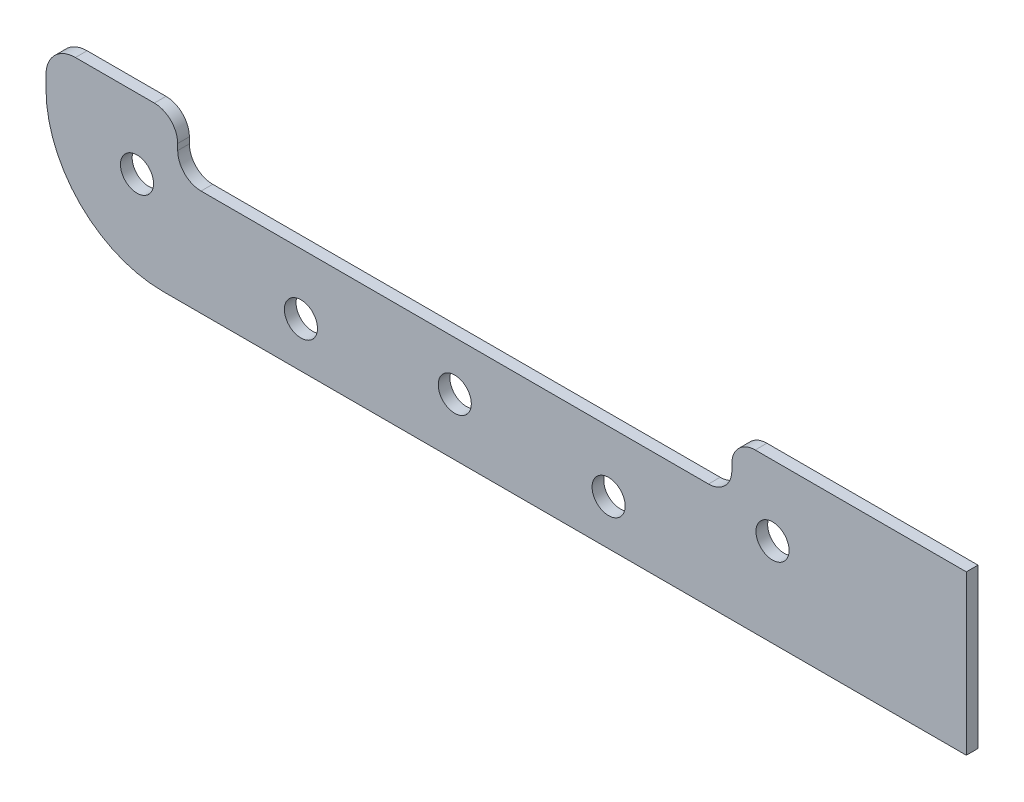
ISO-10303-21;
HEADER;
FILE_DESCRIPTION(('STEP AP214'),'2;1');
FILE_NAME('part.step','',(''),(''),'','','');
FILE_SCHEMA(('AUTOMOTIVE_DESIGN { 1 0 10303 214 1 1 1 1 }'));
ENDSEC;
DATA;
#1=APPLICATION_CONTEXT('core data for automotive mechanical design processes');
#2=APPLICATION_PROTOCOL_DEFINITION('international standard','automotive_design',2000,#1);
#3=PRODUCT_CONTEXT('',#1,'mechanical');
#4=PRODUCT('Part','Part','',(#3));
#5=PRODUCT_RELATED_PRODUCT_CATEGORY('part','',(#4));
#6=PRODUCT_DEFINITION_FORMATION('','',#4);
#7=PRODUCT_DEFINITION_CONTEXT('part definition',#1,'design');
#8=PRODUCT_DEFINITION('design','',#6,#7);
#9=PRODUCT_DEFINITION_SHAPE('','',#8);
#10=(LENGTH_UNIT() NAMED_UNIT(*) SI_UNIT(.MILLI.,.METRE.));
#11=(NAMED_UNIT(*) PLANE_ANGLE_UNIT() SI_UNIT($,.RADIAN.));
#12=(NAMED_UNIT(*) SI_UNIT($,.STERADIAN.) SOLID_ANGLE_UNIT());
#13=UNCERTAINTY_MEASURE_WITH_UNIT(LENGTH_MEASURE(1.E-05),#10,'distance_accuracy_value','');
#14=(GEOMETRIC_REPRESENTATION_CONTEXT(3) GLOBAL_UNCERTAINTY_ASSIGNED_CONTEXT((#13)) GLOBAL_UNIT_ASSIGNED_CONTEXT((#10,
#11,#12)) REPRESENTATION_CONTEXT('',''));
#15=CARTESIAN_POINT('',(0.,0.,0.));
#16=DIRECTION('',(0.,0.,1.));
#17=DIRECTION('',(1.,0.,0.));
#18=AXIS2_PLACEMENT_3D('',#15,#16,#17);
#19=CARTESIAN_POINT('',(0.,0.,-401.50410466235));
#20=DIRECTION('',(0.,0.,1.));
#21=DIRECTION('',(1.,0.,0.));
#22=AXIS2_PLACEMENT_3D('',#19,#20,#21);
#23=PLANE('',#22);
#24=CARTESIAN_POINT('',(14.2600795443492,14.9200516094853,-401.50410466235));
#25=DIRECTION('',(0.,0.,1.));
#26=DIRECTION('',(1.,0.,0.));
#27=AXIS2_PLACEMENT_3D('',#24,#25,#26);
#28=CIRCLE('',#27,2.24999999999999);
#29=CARTESIAN_POINT('',(16.5100795443492,14.9200516094853,-401.50410466235));
#30=VERTEX_POINT('',#29);
#31=EDGE_CURVE('E378',#30,#30,#28,.F.);
#32=ORIENTED_EDGE('',*,*,#31,.F.);
#33=EDGE_LOOP('',(#32));
#34=FACE_BOUND('',#33,.T.);
#35=CARTESIAN_POINT('',(-27.5617458625987,14.9200516094853,-401.50410466235));
#36=DIRECTION('',(0.,0.,1.));
#37=DIRECTION('',(1.,0.,0.));
#38=AXIS2_PLACEMENT_3D('',#35,#36,#37);
#39=CIRCLE('',#38,2.25);
#40=CARTESIAN_POINT('',(-25.3117458625987,14.9200516094853,-401.50410466235));
#41=VERTEX_POINT('',#40);
#42=EDGE_CURVE('E181',#41,#41,#39,.T.);
#43=ORIENTED_EDGE('',*,*,#42,.T.);
#44=EDGE_LOOP('',(#43));
#45=FACE_BOUND('',#44,.T.);
#46=CARTESIAN_POINT('',(36.5405370906553,20.8286813597051,-401.50410466235));
#47=DIRECTION('',(0.,0.,1.));
#48=DIRECTION('',(1.,0.,0.));
#49=AXIS2_PLACEMENT_3D('',#46,#47,#48);
#50=CIRCLE('',#49,2.25);
#51=CARTESIAN_POINT('',(38.7905370906553,20.8286813597051,-401.50410466235));
#52=VERTEX_POINT('',#51);
#53=EDGE_CURVE('E353',#52,#52,#50,.T.);
#54=ORIENTED_EDGE('',*,*,#53,.T.);
#55=EDGE_LOOP('',(#54));
#56=FACE_BOUND('',#55,.T.);
#57=CARTESIAN_POINT('',(-6.65083315912473,16.5103516094852,-401.50410466235));
#58=DIRECTION('',(0.,0.,1.));
#59=DIRECTION('',(1.,0.,0.));
#60=AXIS2_PLACEMENT_3D('',#57,#58,#59);
#61=CIRCLE('',#60,2.25);
#62=CARTESIAN_POINT('',(-4.40083315912473,16.5103516094852,-401.50410466235));
#63=VERTEX_POINT('',#62);
#64=EDGE_CURVE('E361',#63,#63,#61,.T.);
#65=ORIENTED_EDGE('',*,*,#64,.T.);
#66=EDGE_LOOP('',(#65));
#67=FACE_BOUND('',#66,.T.);
#68=CARTESIAN_POINT('',(-49.8422034089049,20.8286813597051,-401.50410466235));
#69=DIRECTION('',(0.,0.,1.));
#70=DIRECTION('',(1.,0.,0.));
#71=AXIS2_PLACEMENT_3D('',#68,#69,#70);
#72=CIRCLE('',#71,2.25);
#73=CARTESIAN_POINT('',(-47.5922034089049,20.8286813597051,-401.50410466235));
#74=VERTEX_POINT('',#73);
#75=EDGE_CURVE('E369',#74,#74,#72,.T.);
#76=ORIENTED_EDGE('',*,*,#75,.T.);
#77=EDGE_LOOP('',(#76));
#78=FACE_BOUND('',#77,.T.);
#79=DIRECTION('',(1.,0.,0.));
#80=VECTOR('',#79,1.);
#81=CARTESIAN_POINT('',(0.,30.3650516094852,-401.50410466235));
#82=LINE('',#81,#80);
#83=CARTESIAN_POINT('',(-58.2133331591248,30.3650516094852,-401.50410466235));
#84=VERTEX_POINT('',#83);
#85=CARTESIAN_POINT('',(-47.4880526440947,30.3650516094852,-401.50410466235));
#86=VERTEX_POINT('',#85);
#87=EDGE_CURVE('E191',#84,#86,#82,.T.);
#88=ORIENTED_EDGE('',*,*,#87,.T.);
#89=CARTESIAN_POINT('',(-47.4880526440947,27.1900516094852,-401.50410466235));
#90=DIRECTION('',(0.,0.,1.));
#91=DIRECTION('',(1.,0.,0.));
#92=AXIS2_PLACEMENT_3D('',#89,#90,#91);
#93=CIRCLE('',#92,3.175);
#94=CARTESIAN_POINT('',(-44.3130526440947,27.1900516094852,-401.50410466235));
#95=VERTEX_POINT('',#94);
#96=EDGE_CURVE('E259',#86,#95,#93,.F.);
#97=ORIENTED_EDGE('',*,*,#96,.T.);
#98=DIRECTION('',(0.,1.,0.));
#99=VECTOR('',#98,1.);
#100=CARTESIAN_POINT('',(-44.3130526440947,0.,-401.50410466235));
#101=LINE('',#100,#99);
#102=CARTESIAN_POINT('',(-44.3130526440947,26.3578321245151,-401.50410466235));
#103=VERTEX_POINT('',#102);
#104=EDGE_CURVE('E206',#103,#95,#101,.T.);
#105=ORIENTED_EDGE('',*,*,#104,.F.);
#106=CARTESIAN_POINT('',(-41.1380526440947,26.3578321245151,-401.50410466235));
#107=DIRECTION('',(0.,0.,1.));
#108=DIRECTION('',(1.,0.,0.));
#109=AXIS2_PLACEMENT_3D('',#106,#107,#108);
#110=CIRCLE('',#109,3.175);
#111=CARTESIAN_POINT('',(-41.1380526440947,23.1828321245151,-401.50410466235));
#112=VERTEX_POINT('',#111);
#113=EDGE_CURVE('E292',#103,#112,#110,.T.);
#114=ORIENTED_EDGE('',*,*,#113,.T.);
#115=DIRECTION('',(-1.,0.,0.));
#116=VECTOR('',#115,1.);
#117=CARTESIAN_POINT('',(0.,23.1828321245151,-401.50410466235));
#118=LINE('',#117,#116);
#119=CARTESIAN_POINT('',(27.8363863258453,23.1828321245151,-401.50410466235));
#120=VERTEX_POINT('',#119);
#121=EDGE_CURVE('E305',#120,#112,#118,.T.);
#122=ORIENTED_EDGE('',*,*,#121,.F.);
#123=CARTESIAN_POINT('',(27.8363863258453,26.3578321245151,-401.50410466235));
#124=DIRECTION('',(0.,0.,1.));
#125=DIRECTION('',(1.,0.,0.));
#126=AXIS2_PLACEMENT_3D('',#123,#124,#125);
#127=CIRCLE('',#126,3.175);
#128=CARTESIAN_POINT('',(31.0113863258453,26.3578321245151,-401.50410466235));
#129=VERTEX_POINT('',#128);
#130=EDGE_CURVE('E12',#120,#129,#127,.T.);
#131=ORIENTED_EDGE('',*,*,#130,.T.);
#132=DIRECTION('',(0.,1.,0.));
#133=VECTOR('',#132,1.);
#134=CARTESIAN_POINT('',(31.0113863258453,0.,-401.50410466235));
#135=LINE('',#134,#133);
#136=CARTESIAN_POINT('',(31.0113863258453,27.1900516094852,-401.50410466235));
#137=VERTEX_POINT('',#136);
#138=EDGE_CURVE('E199',#129,#137,#135,.T.);
#139=ORIENTED_EDGE('',*,*,#138,.T.);
#140=CARTESIAN_POINT('',(34.1863863258453,27.1900516094852,-401.50410466235));
#141=DIRECTION('',(0.,0.,1.));
#142=DIRECTION('',(1.,0.,0.));
#143=AXIS2_PLACEMENT_3D('',#140,#141,#142);
#144=CIRCLE('',#143,3.175);
#145=CARTESIAN_POINT('',(34.1863863258453,30.3650516094852,-401.50410466235));
#146=VERTEX_POINT('',#145);
#147=EDGE_CURVE('E256',#137,#146,#144,.F.);
#148=ORIENTED_EDGE('',*,*,#147,.T.);
#149=CARTESIAN_POINT('',(62.8816668408752,30.3650516094852,-401.50410466235));
#150=VERTEX_POINT('',#149);
#151=EDGE_CURVE('E316',#146,#150,#82,.T.);
#152=ORIENTED_EDGE('',*,*,#151,.T.);
#153=DIRECTION('',(0.,1.,0.));
#154=VECTOR('',#153,1.);
#155=CARTESIAN_POINT('',(62.8816668408752,201.815051609485,-401.50410466235));
#156=LINE('',#155,#154);
#157=CARTESIAN_POINT('',(62.8816668408752,8.77505160948519,-401.50410466235));
#158=VERTEX_POINT('',#157);
#159=EDGE_CURVE('E189',#158,#150,#156,.T.);
#160=ORIENTED_EDGE('',*,*,#159,.F.);
#161=DIRECTION('',(-1.,0.,0.));
#162=VECTOR('',#161,1.);
#163=CARTESIAN_POINT('',(0.,8.77505160948518,-401.50410466235));
#164=LINE('',#163,#162);
#165=CARTESIAN_POINT('',(-46.3383331591248,8.77505160948517,-401.50410466235));
#166=VERTEX_POINT('',#165);
#167=EDGE_CURVE('E217',#158,#166,#164,.T.);
#168=ORIENTED_EDGE('',*,*,#167,.T.);
#169=CARTESIAN_POINT('',(-46.3383331591248,24.6500516094852,-401.50410466235));
#170=DIRECTION('',(0.,0.,1.));
#171=DIRECTION('',(1.,0.,0.));
#172=AXIS2_PLACEMENT_3D('',#169,#170,#171);
#173=CIRCLE('',#172,15.875);
#174=CARTESIAN_POINT('',(-62.2133331591248,24.6500516094852,-401.50410466235));
#175=VERTEX_POINT('',#174);
#176=EDGE_CURVE('E229',#166,#175,#173,.F.);
#177=ORIENTED_EDGE('',*,*,#176,.T.);
#178=DIRECTION('',(0.,1.,0.));
#179=VECTOR('',#178,1.);
#180=CARTESIAN_POINT('',(-62.2133331591248,0.,-401.50410466235));
#181=LINE('',#180,#179);
#182=CARTESIAN_POINT('',(-62.2133331591248,26.3650516094852,-401.50410466235));
#183=VERTEX_POINT('',#182);
#184=EDGE_CURVE('E212',#175,#183,#181,.T.);
#185=ORIENTED_EDGE('',*,*,#184,.T.);
#186=CARTESIAN_POINT('',(-58.2133331591248,26.3650516094852,-401.50410466235));
#187=DIRECTION('',(0.,0.,1.));
#188=DIRECTION('',(1.,0.,0.));
#189=AXIS2_PLACEMENT_3D('',#186,#187,#188);
#190=CIRCLE('',#189,4.);
#191=EDGE_CURVE('E249',#183,#84,#190,.F.);
#192=ORIENTED_EDGE('',*,*,#191,.T.);
#193=EDGE_LOOP('',(#88,#97,#105,#114,#122,#131,#139,#148,#152,#160,#168,#177,#185,#192));
#194=FACE_BOUND('',#193,.T.);
#195=ADVANCED_FACE('F68',(#34,#45,#56,#67,#78,#194),#23,.F.);
#196=CARTESIAN_POINT('',(0.,0.,-399.91660466235));
#197=DIRECTION('',(0.,0.,1.));
#198=DIRECTION('',(1.,0.,0.));
#199=AXIS2_PLACEMENT_3D('',#196,#197,#198);
#200=PLANE('',#199);
#201=CARTESIAN_POINT('',(-27.5617458625987,14.9200516094853,-399.91660466235));
#202=DIRECTION('',(0.,0.,1.));
#203=DIRECTION('',(1.,0.,0.));
#204=AXIS2_PLACEMENT_3D('',#201,#202,#203);
#205=CIRCLE('',#204,2.24999999999999);
#206=CARTESIAN_POINT('',(-25.3117458625987,14.9200516094853,-399.91660466235));
#207=VERTEX_POINT('',#206);
#208=EDGE_CURVE('E349',#207,#207,#205,.T.);
#209=ORIENTED_EDGE('',*,*,#208,.F.);
#210=EDGE_LOOP('',(#209));
#211=FACE_BOUND('',#210,.T.);
#212=CARTESIAN_POINT('',(36.5405370906553,20.8286813597051,-399.91660466235));
#213=DIRECTION('',(0.,0.,1.));
#214=DIRECTION('',(1.,0.,0.));
#215=AXIS2_PLACEMENT_3D('',#212,#213,#214);
#216=CIRCLE('',#215,2.24999999999999);
#217=CARTESIAN_POINT('',(38.7905370906553,20.8286813597051,-399.91660466235));
#218=VERTEX_POINT('',#217);
#219=EDGE_CURVE('E357',#218,#218,#216,.T.);
#220=ORIENTED_EDGE('',*,*,#219,.F.);
#221=EDGE_LOOP('',(#220));
#222=FACE_BOUND('',#221,.T.);
#223=CARTESIAN_POINT('',(-6.65083315912473,16.5103516094852,-399.91660466235));
#224=DIRECTION('',(0.,0.,1.));
#225=DIRECTION('',(1.,0.,0.));
#226=AXIS2_PLACEMENT_3D('',#223,#224,#225);
#227=CIRCLE('',#226,2.24999999999999);
#228=CARTESIAN_POINT('',(-4.40083315912474,16.5103516094852,-399.91660466235));
#229=VERTEX_POINT('',#228);
#230=EDGE_CURVE('E365',#229,#229,#227,.T.);
#231=ORIENTED_EDGE('',*,*,#230,.F.);
#232=EDGE_LOOP('',(#231));
#233=FACE_BOUND('',#232,.T.);
#234=CARTESIAN_POINT('',(-49.8422034089049,20.8286813597051,-399.91660466235));
#235=DIRECTION('',(0.,0.,1.));
#236=DIRECTION('',(1.,0.,0.));
#237=AXIS2_PLACEMENT_3D('',#234,#235,#236);
#238=CIRCLE('',#237,2.24999999999999);
#239=CARTESIAN_POINT('',(-47.5922034089049,20.8286813597051,-399.91660466235));
#240=VERTEX_POINT('',#239);
#241=EDGE_CURVE('E373',#240,#240,#238,.T.);
#242=ORIENTED_EDGE('',*,*,#241,.F.);
#243=EDGE_LOOP('',(#242));
#244=FACE_BOUND('',#243,.T.);
#245=CARTESIAN_POINT('',(14.2600795443492,14.9200516094853,-399.91660466235));
#246=DIRECTION('',(0.,0.,1.));
#247=DIRECTION('',(1.,0.,0.));
#248=AXIS2_PLACEMENT_3D('',#245,#246,#247);
#249=CIRCLE('',#248,2.24999999999999);
#250=CARTESIAN_POINT('',(16.5100795443492,14.9200516094853,-399.91660466235));
#251=VERTEX_POINT('',#250);
#252=EDGE_CURVE('E377',#251,#251,#249,.F.);
#253=ORIENTED_EDGE('',*,*,#252,.T.);
#254=EDGE_LOOP('',(#253));
#255=FACE_BOUND('',#254,.T.);
#256=DIRECTION('',(0.,1.,0.));
#257=VECTOR('',#256,1.);
#258=CARTESIAN_POINT('',(-44.3130526440947,0.,-399.91660466235));
#259=LINE('',#258,#257);
#260=CARTESIAN_POINT('',(-44.3130526440947,26.3578321245151,-399.91660466235));
#261=VERTEX_POINT('',#260);
#262=CARTESIAN_POINT('',(-44.3130526440947,27.1900516094852,-399.91660466235));
#263=VERTEX_POINT('',#262);
#264=EDGE_CURVE('E318',#261,#263,#259,.T.);
#265=ORIENTED_EDGE('',*,*,#264,.T.);
#266=CARTESIAN_POINT('',(-47.4880526440947,27.1900516094852,-399.91660466235));
#267=DIRECTION('',(0.,0.,1.));
#268=DIRECTION('',(1.,0.,0.));
#269=AXIS2_PLACEMENT_3D('',#266,#267,#268);
#270=CIRCLE('',#269,3.175);
#271=CARTESIAN_POINT('',(-47.4880526440947,30.3650516094852,-399.91660466235));
#272=VERTEX_POINT('',#271);
#273=EDGE_CURVE('E270',#263,#272,#270,.T.);
#274=ORIENTED_EDGE('',*,*,#273,.T.);
#275=DIRECTION('',(1.,0.,0.));
#276=VECTOR('',#275,1.);
#277=CARTESIAN_POINT('',(-62.2133331591248,30.3650516094852,-399.91660466235));
#278=LINE('',#277,#276);
#279=CARTESIAN_POINT('',(-58.2133331591248,30.3650516094852,-399.91660466235));
#280=VERTEX_POINT('',#279);
#281=EDGE_CURVE('E180',#280,#272,#278,.T.);
#282=ORIENTED_EDGE('',*,*,#281,.F.);
#283=CARTESIAN_POINT('',(-58.2133331591248,26.3650516094852,-399.91660466235));
#284=DIRECTION('',(0.,0.,1.));
#285=DIRECTION('',(1.,0.,0.));
#286=AXIS2_PLACEMENT_3D('',#283,#284,#285);
#287=CIRCLE('',#286,4.);
#288=CARTESIAN_POINT('',(-62.2133331591248,26.3650516094852,-399.91660466235));
#289=VERTEX_POINT('',#288);
#290=EDGE_CURVE('E243',#280,#289,#287,.T.);
#291=ORIENTED_EDGE('',*,*,#290,.T.);
#292=DIRECTION('',(0.,1.,0.));
#293=VECTOR('',#292,1.);
#294=CARTESIAN_POINT('',(-62.2133331591248,0.,-399.91660466235));
#295=LINE('',#294,#293);
#296=CARTESIAN_POINT('',(-62.2133331591248,24.6500516094852,-399.91660466235));
#297=VERTEX_POINT('',#296);
#298=EDGE_CURVE('E213',#297,#289,#295,.T.);
#299=ORIENTED_EDGE('',*,*,#298,.F.);
#300=CARTESIAN_POINT('',(-46.3383331591248,24.6500516094852,-399.91660466235));
#301=DIRECTION('',(0.,0.,1.));
#302=DIRECTION('',(1.,0.,0.));
#303=AXIS2_PLACEMENT_3D('',#300,#301,#302);
#304=CIRCLE('',#303,15.875);
#305=CARTESIAN_POINT('',(-46.3383331591248,8.77505160948517,-399.91660466235));
#306=VERTEX_POINT('',#305);
#307=EDGE_CURVE('E232',#297,#306,#304,.T.);
#308=ORIENTED_EDGE('',*,*,#307,.T.);
#309=DIRECTION('',(-1.,0.,0.));
#310=VECTOR('',#309,1.);
#311=CARTESIAN_POINT('',(0.,8.77505160948518,-399.91660466235));
#312=LINE('',#311,#310);
#313=CARTESIAN_POINT('',(62.8816668408752,8.77505160948519,-399.91660466235));
#314=VERTEX_POINT('',#313);
#315=EDGE_CURVE('E196',#314,#306,#312,.T.);
#316=ORIENTED_EDGE('',*,*,#315,.F.);
#317=DIRECTION('',(0.,1.,0.));
#318=VECTOR('',#317,1.);
#319=CARTESIAN_POINT('',(62.8816668408752,201.815051609485,-399.91660466235));
#320=LINE('',#319,#318);
#321=CARTESIAN_POINT('',(62.8816668408752,30.3650516094852,-399.91660466235));
#322=VERTEX_POINT('',#321);
#323=EDGE_CURVE('E187',#314,#322,#320,.T.);
#324=ORIENTED_EDGE('',*,*,#323,.T.);
#325=CARTESIAN_POINT('',(34.1863863258453,30.3650516094852,-399.91660466235));
#326=VERTEX_POINT('',#325);
#327=EDGE_CURVE('E170',#326,#322,#278,.T.);
#328=ORIENTED_EDGE('',*,*,#327,.F.);
#329=CARTESIAN_POINT('',(34.1863863258453,27.1900516094852,-399.91660466235));
#330=DIRECTION('',(0.,0.,1.));
#331=DIRECTION('',(1.,0.,0.));
#332=AXIS2_PLACEMENT_3D('',#329,#330,#331);
#333=CIRCLE('',#332,3.175);
#334=CARTESIAN_POINT('',(31.0113863258453,27.1900516094852,-399.91660466235));
#335=VERTEX_POINT('',#334);
#336=EDGE_CURVE('E84',#326,#335,#333,.T.);
#337=ORIENTED_EDGE('',*,*,#336,.T.);
#338=DIRECTION('',(0.,1.,0.));
#339=VECTOR('',#338,1.);
#340=CARTESIAN_POINT('',(31.0113863258453,0.,-399.91660466235));
#341=LINE('',#340,#339);
#342=CARTESIAN_POINT('',(31.0113863258453,26.3578321245151,-399.91660466235));
#343=VERTEX_POINT('',#342);
#344=EDGE_CURVE('E298',#343,#335,#341,.T.);
#345=ORIENTED_EDGE('',*,*,#344,.F.);
#346=CARTESIAN_POINT('',(27.8363863258453,26.3578321245151,-399.91660466235));
#347=DIRECTION('',(0.,0.,1.));
#348=DIRECTION('',(1.,0.,0.));
#349=AXIS2_PLACEMENT_3D('',#346,#347,#348);
#350=CIRCLE('',#349,3.175);
#351=CARTESIAN_POINT('',(27.8363863258453,23.1828321245151,-399.91660466235));
#352=VERTEX_POINT('',#351);
#353=EDGE_CURVE('E77',#343,#352,#350,.F.);
#354=ORIENTED_EDGE('',*,*,#353,.T.);
#355=DIRECTION('',(-1.,0.,0.));
#356=VECTOR('',#355,1.);
#357=CARTESIAN_POINT('',(0.,23.1828321245151,-399.91660466235));
#358=LINE('',#357,#356);
#359=CARTESIAN_POINT('',(-41.1380526440947,23.1828321245151,-399.91660466235));
#360=VERTEX_POINT('',#359);
#361=EDGE_CURVE('E297',#352,#360,#358,.T.);
#362=ORIENTED_EDGE('',*,*,#361,.T.);
#363=CARTESIAN_POINT('',(-41.1380526440947,26.3578321245151,-399.91660466235));
#364=DIRECTION('',(0.,0.,1.));
#365=DIRECTION('',(1.,0.,0.));
#366=AXIS2_PLACEMENT_3D('',#363,#364,#365);
#367=CIRCLE('',#366,3.175);
#368=EDGE_CURVE('E289',#360,#261,#367,.F.);
#369=ORIENTED_EDGE('',*,*,#368,.T.);
#370=EDGE_LOOP('',(#265,#274,#282,#291,#299,#308,#316,#324,#328,#337,#345,#354,#362,#369));
#371=FACE_BOUND('',#370,.T.);
#372=ADVANCED_FACE('F194',(#211,#222,#233,#244,#255,#371),#200,.T.);
#373=CARTESIAN_POINT('',(-46.3383331591248,24.6500516094852,-399.91660466235));
#374=DIRECTION('',(0.,0.,-1.));
#375=DIRECTION('',(-1.,0.,0.));
#376=AXIS2_PLACEMENT_3D('',#373,#374,#375);
#377=CYLINDRICAL_SURFACE('',#376,15.875);
#378=ORIENTED_EDGE('',*,*,#307,.F.);
#379=DIRECTION('',(0.,0.,-1.));
#380=VECTOR('',#379,1.);
#381=CARTESIAN_POINT('',(-62.2133331591248,24.6500516094852,-399.91660466235));
#382=LINE('',#381,#380);
#383=EDGE_CURVE('E220',#175,#297,#382,.F.);
#384=ORIENTED_EDGE('',*,*,#383,.F.);
#385=ORIENTED_EDGE('',*,*,#176,.F.);
#386=DIRECTION('',(0.,0.,-1.));
#387=VECTOR('',#386,1.);
#388=CARTESIAN_POINT('',(-46.3383331591248,8.77505160948517,-399.91660466235));
#389=LINE('',#388,#387);
#390=EDGE_CURVE('E235',#306,#166,#389,.T.);
#391=ORIENTED_EDGE('',*,*,#390,.F.);
#392=EDGE_LOOP('',(#378,#384,#385,#391));
#393=FACE_BOUND('',#392,.T.);
#394=ADVANCED_FACE('F401',(#393),#377,.T.);
#395=CARTESIAN_POINT('',(0.,8.77505160948518,-399.91660466235));
#396=DIRECTION('',(0.,-1.,0.));
#397=DIRECTION('',(1.,0.,0.));
#398=AXIS2_PLACEMENT_3D('',#395,#396,#397);
#399=PLANE('',#398);
#400=ORIENTED_EDGE('',*,*,#315,.T.);
#401=ORIENTED_EDGE('',*,*,#390,.T.);
#402=ORIENTED_EDGE('',*,*,#167,.F.);
#403=DIRECTION('',(0.,0.,1.));
#404=VECTOR('',#403,1.);
#405=CARTESIAN_POINT('',(62.8816668408752,8.77505160948519,-401.50410466235));
#406=LINE('',#405,#404);
#407=EDGE_CURVE('E203',#158,#314,#406,.T.);
#408=ORIENTED_EDGE('',*,*,#407,.T.);
#409=EDGE_LOOP('',(#400,#401,#402,#408));
#410=FACE_BOUND('',#409,.T.);
#411=ADVANCED_FACE('F408',(#410),#399,.T.);
#412=CARTESIAN_POINT('',(62.8816668408752,201.815051609485,-401.50410466235));
#413=DIRECTION('',(1.,0.,0.));
#414=DIRECTION('',(0.,1.,0.));
#415=AXIS2_PLACEMENT_3D('',#412,#413,#414);
#416=PLANE('',#415);
#417=DIRECTION('',(0.,0.,1.));
#418=VECTOR('',#417,1.);
#419=CARTESIAN_POINT('',(62.8816668408752,30.3650516094852,-479.91660466235));
#420=LINE('',#419,#418);
#421=EDGE_CURVE('E174',#150,#322,#420,.T.);
#422=ORIENTED_EDGE('',*,*,#421,.T.);
#423=ORIENTED_EDGE('',*,*,#323,.F.);
#424=ORIENTED_EDGE('',*,*,#407,.F.);
#425=ORIENTED_EDGE('',*,*,#159,.T.);
#426=EDGE_LOOP('',(#422,#423,#424,#425));
#427=FACE_BOUND('',#426,.T.);
#428=ADVANCED_FACE('F185',(#427),#416,.T.);
#429=CARTESIAN_POINT('',(31.0113863258453,0.,-401.50410466235));
#430=DIRECTION('',(1.,0.,0.));
#431=DIRECTION('',(0.,0.,-1.));
#432=AXIS2_PLACEMENT_3D('',#429,#430,#431);
#433=PLANE('',#432);
#434=ORIENTED_EDGE('',*,*,#344,.T.);
#435=DIRECTION('',(0.,0.,-1.));
#436=VECTOR('',#435,1.);
#437=CARTESIAN_POINT('',(31.0113863258453,27.1900516094852,-401.50410466235));
#438=LINE('',#437,#436);
#439=EDGE_CURVE('E276',#335,#137,#438,.T.);
#440=ORIENTED_EDGE('',*,*,#439,.T.);
#441=ORIENTED_EDGE('',*,*,#138,.F.);
#442=DIRECTION('',(0.,0.,1.));
#443=VECTOR('',#442,1.);
#444=CARTESIAN_POINT('',(31.0113863258453,26.3578321245151,-401.50410466235));
#445=LINE('',#444,#443);
#446=EDGE_CURVE('E273',#129,#343,#445,.T.);
#447=ORIENTED_EDGE('',*,*,#446,.T.);
#448=EDGE_LOOP('',(#434,#440,#441,#447));
#449=FACE_BOUND('',#448,.T.);
#450=ADVANCED_FACE('F312',(#449),#433,.F.);
#451=CARTESIAN_POINT('',(-44.3130526440947,0.,-401.50410466235));
#452=DIRECTION('',(1.,0.,0.));
#453=DIRECTION('',(0.,1.,0.));
#454=AXIS2_PLACEMENT_3D('',#451,#452,#453);
#455=PLANE('',#454);
#456=ORIENTED_EDGE('',*,*,#104,.T.);
#457=DIRECTION('',(0.,0.,-1.));
#458=VECTOR('',#457,1.);
#459=CARTESIAN_POINT('',(-44.3130526440947,27.1900516094852,-399.91660466235));
#460=LINE('',#459,#458);
#461=EDGE_CURVE('E265',#95,#263,#460,.F.);
#462=ORIENTED_EDGE('',*,*,#461,.T.);
#463=ORIENTED_EDGE('',*,*,#264,.F.);
#464=DIRECTION('',(0.,0.,1.));
#465=VECTOR('',#464,1.);
#466=CARTESIAN_POINT('',(-44.3130526440947,26.3578321245151,-401.50410466235));
#467=LINE('',#466,#465);
#468=EDGE_CURVE('E262',#261,#103,#467,.F.);
#469=ORIENTED_EDGE('',*,*,#468,.T.);
#470=EDGE_LOOP('',(#456,#462,#463,#469));
#471=FACE_BOUND('',#470,.T.);
#472=ADVANCED_FACE('F330',(#471),#455,.T.);
#473=CARTESIAN_POINT('',(-62.2133331591248,0.,-399.91660466235));
#474=DIRECTION('',(-1.,0.,0.));
#475=DIRECTION('',(0.,0.,1.));
#476=AXIS2_PLACEMENT_3D('',#473,#474,#475);
#477=PLANE('',#476);
#478=ORIENTED_EDGE('',*,*,#298,.T.);
#479=DIRECTION('',(0.,0.,1.));
#480=VECTOR('',#479,1.);
#481=CARTESIAN_POINT('',(-62.2133331591248,26.3650516094852,-401.50410466235));
#482=LINE('',#481,#480);
#483=EDGE_CURVE('E246',#289,#183,#482,.F.);
#484=ORIENTED_EDGE('',*,*,#483,.T.);
#485=ORIENTED_EDGE('',*,*,#184,.F.);
#486=ORIENTED_EDGE('',*,*,#383,.T.);
#487=EDGE_LOOP('',(#478,#484,#485,#486));
#488=FACE_BOUND('',#487,.T.);
#489=ADVANCED_FACE('F412',(#488),#477,.T.);
#490=CARTESIAN_POINT('',(-62.2133331591248,30.3650516094852,-479.91660466235));
#491=DIRECTION('',(0.,-1.,0.));
#492=DIRECTION('',(0.,0.,-1.));
#493=AXIS2_PLACEMENT_3D('',#490,#491,#492);
#494=PLANE('',#493);
#495=ORIENTED_EDGE('',*,*,#281,.T.);
#496=DIRECTION('',(0.,0.,-1.));
#497=VECTOR('',#496,1.);
#498=CARTESIAN_POINT('',(-47.4880526440947,30.3650516094852,-401.50410466235));
#499=LINE('',#498,#497);
#500=EDGE_CURVE('E252',#272,#86,#499,.T.);
#501=ORIENTED_EDGE('',*,*,#500,.T.);
#502=ORIENTED_EDGE('',*,*,#87,.F.);
#503=DIRECTION('',(0.,0.,1.));
#504=VECTOR('',#503,1.);
#505=CARTESIAN_POINT('',(-58.2133331591248,30.3650516094852,-399.91660466235));
#506=LINE('',#505,#504);
#507=EDGE_CURVE('E239',#84,#280,#506,.T.);
#508=ORIENTED_EDGE('',*,*,#507,.T.);
#509=EDGE_LOOP('',(#495,#501,#502,#508));
#510=FACE_BOUND('',#509,.T.);
#511=ADVANCED_FACE('F341',(#510),#494,.F.);
#512=ORIENTED_EDGE('',*,*,#151,.F.);
#513=DIRECTION('',(0.,0.,-1.));
#514=VECTOR('',#513,1.);
#515=CARTESIAN_POINT('',(34.1863863258453,30.3650516094852,-479.91660466235));
#516=LINE('',#515,#514);
#517=EDGE_CURVE('E177',#146,#326,#516,.F.);
#518=ORIENTED_EDGE('',*,*,#517,.T.);
#519=ORIENTED_EDGE('',*,*,#327,.T.);
#520=ORIENTED_EDGE('',*,*,#421,.F.);
#521=EDGE_LOOP('',(#512,#518,#519,#520));
#522=FACE_BOUND('',#521,.T.);
#523=ADVANCED_FACE('F173',(#522),#494,.F.);
#524=CARTESIAN_POINT('',(-58.2133331591248,26.3650516094852,-479.91660466235));
#525=DIRECTION('',(0.,0.,-1.));
#526=DIRECTION('',(-1.,0.,0.));
#527=AXIS2_PLACEMENT_3D('',#524,#525,#526);
#528=CYLINDRICAL_SURFACE('',#527,4.);
#529=ORIENTED_EDGE('',*,*,#191,.F.);
#530=ORIENTED_EDGE('',*,*,#483,.F.);
#531=ORIENTED_EDGE('',*,*,#290,.F.);
#532=ORIENTED_EDGE('',*,*,#507,.F.);
#533=EDGE_LOOP('',(#529,#530,#531,#532));
#534=FACE_BOUND('',#533,.T.);
#535=ADVANCED_FACE('F419',(#534),#528,.T.);
#536=CARTESIAN_POINT('',(-27.5617458625987,14.9200516094853,-399.91660466235));
#537=DIRECTION('',(0.,0.,1.));
#538=DIRECTION('',(1.,0.,0.));
#539=AXIS2_PLACEMENT_3D('',#536,#537,#538);
#540=CYLINDRICAL_SURFACE('',#539,2.25);
#541=ORIENTED_EDGE('',*,*,#42,.F.);
#542=EDGE_LOOP('',(#541));
#543=FACE_BOUND('',#542,.T.);
#544=ORIENTED_EDGE('',*,*,#208,.T.);
#545=EDGE_LOOP('',(#544));
#546=FACE_BOUND('',#545,.T.);
#547=ADVANCED_FACE('F422',(#543,#546),#540,.F.);
#548=CARTESIAN_POINT('',(36.5405370906553,20.8286813597051,-399.91660466235));
#549=DIRECTION('',(0.,0.,1.));
#550=DIRECTION('',(1.,0.,0.));
#551=AXIS2_PLACEMENT_3D('',#548,#549,#550);
#552=CYLINDRICAL_SURFACE('',#551,2.25);
#553=ORIENTED_EDGE('',*,*,#53,.F.);
#554=EDGE_LOOP('',(#553));
#555=FACE_BOUND('',#554,.T.);
#556=ORIENTED_EDGE('',*,*,#219,.T.);
#557=EDGE_LOOP('',(#556));
#558=FACE_BOUND('',#557,.T.);
#559=ADVANCED_FACE('F443',(#555,#558),#552,.F.);
#560=CARTESIAN_POINT('',(-6.65083315912473,16.5103516094852,-399.91660466235));
#561=DIRECTION('',(0.,0.,1.));
#562=DIRECTION('',(1.,0.,0.));
#563=AXIS2_PLACEMENT_3D('',#560,#561,#562);
#564=CYLINDRICAL_SURFACE('',#563,2.24999999999999);
#565=ORIENTED_EDGE('',*,*,#64,.F.);
#566=EDGE_LOOP('',(#565));
#567=FACE_BOUND('',#566,.T.);
#568=ORIENTED_EDGE('',*,*,#230,.T.);
#569=EDGE_LOOP('',(#568));
#570=FACE_BOUND('',#569,.T.);
#571=ADVANCED_FACE('F439',(#567,#570),#564,.F.);
#572=CARTESIAN_POINT('',(-49.8422034089049,20.8286813597051,-399.91660466235));
#573=DIRECTION('',(0.,0.,1.));
#574=DIRECTION('',(1.,0.,0.));
#575=AXIS2_PLACEMENT_3D('',#572,#573,#574);
#576=CYLINDRICAL_SURFACE('',#575,2.25);
#577=ORIENTED_EDGE('',*,*,#75,.F.);
#578=EDGE_LOOP('',(#577));
#579=FACE_BOUND('',#578,.T.);
#580=ORIENTED_EDGE('',*,*,#241,.T.);
#581=EDGE_LOOP('',(#580));
#582=FACE_BOUND('',#581,.T.);
#583=ADVANCED_FACE('F433',(#579,#582),#576,.F.);
#584=CARTESIAN_POINT('',(14.2600795443492,14.9200516094853,-401.50410466235));
#585=DIRECTION('',(0.,0.,1.));
#586=DIRECTION('',(1.,0.,0.));
#587=AXIS2_PLACEMENT_3D('',#584,#585,#586);
#588=CYLINDRICAL_SURFACE('',#587,2.24999999999999);
#589=ORIENTED_EDGE('',*,*,#31,.T.);
#590=EDGE_LOOP('',(#589));
#591=FACE_BOUND('',#590,.T.);
#592=ORIENTED_EDGE('',*,*,#252,.F.);
#593=EDGE_LOOP('',(#592));
#594=FACE_BOUND('',#593,.T.);
#595=ADVANCED_FACE('F428',(#591,#594),#588,.F.);
#596=CARTESIAN_POINT('',(0.,23.1828321245151,-401.50410466235));
#597=DIRECTION('',(0.,1.,0.));
#598=DIRECTION('',(-1.,0.,0.));
#599=AXIS2_PLACEMENT_3D('',#596,#597,#598);
#600=PLANE('',#599);
#601=ORIENTED_EDGE('',*,*,#121,.T.);
#602=DIRECTION('',(0.,0.,1.));
#603=VECTOR('',#602,1.);
#604=CARTESIAN_POINT('',(-41.1380526440947,23.1828321245151,-399.91660466235));
#605=LINE('',#604,#603);
#606=EDGE_CURVE('E285',#112,#360,#605,.T.);
#607=ORIENTED_EDGE('',*,*,#606,.T.);
#608=ORIENTED_EDGE('',*,*,#361,.F.);
#609=DIRECTION('',(0.,0.,1.));
#610=VECTOR('',#609,1.);
#611=CARTESIAN_POINT('',(27.8363863258453,23.1828321245151,-401.50410466235));
#612=LINE('',#611,#610);
#613=EDGE_CURVE('E282',#352,#120,#612,.F.);
#614=ORIENTED_EDGE('',*,*,#613,.T.);
#615=EDGE_LOOP('',(#601,#607,#608,#614));
#616=FACE_BOUND('',#615,.T.);
#617=ADVANCED_FACE('F301',(#616),#600,.T.);
#618=CARTESIAN_POINT('',(-47.4880526440947,27.1900516094852,-479.91660466235));
#619=DIRECTION('',(0.,0.,1.));
#620=DIRECTION('',(1.,0.,0.));
#621=AXIS2_PLACEMENT_3D('',#618,#619,#620);
#622=CYLINDRICAL_SURFACE('',#621,3.175);
#623=ORIENTED_EDGE('',*,*,#273,.F.);
#624=ORIENTED_EDGE('',*,*,#461,.F.);
#625=ORIENTED_EDGE('',*,*,#96,.F.);
#626=ORIENTED_EDGE('',*,*,#500,.F.);
#627=EDGE_LOOP('',(#623,#624,#625,#626));
#628=FACE_BOUND('',#627,.T.);
#629=ADVANCED_FACE('F336',(#628),#622,.T.);
#630=CARTESIAN_POINT('',(34.1863863258453,27.1900516094852,-401.50410466235));
#631=DIRECTION('',(0.,0.,-1.));
#632=DIRECTION('',(-1.,0.,0.));
#633=AXIS2_PLACEMENT_3D('',#630,#631,#632);
#634=CYLINDRICAL_SURFACE('',#633,3.175);
#635=ORIENTED_EDGE('',*,*,#336,.F.);
#636=ORIENTED_EDGE('',*,*,#517,.F.);
#637=ORIENTED_EDGE('',*,*,#147,.F.);
#638=ORIENTED_EDGE('',*,*,#439,.F.);
#639=EDGE_LOOP('',(#635,#636,#637,#638));
#640=FACE_BOUND('',#639,.T.);
#641=ADVANCED_FACE('F315',(#640),#634,.T.);
#642=CARTESIAN_POINT('',(-41.1380526440947,26.3578321245151,-401.50410466235));
#643=DIRECTION('',(0.,0.,-1.));
#644=DIRECTION('',(-1.,0.,0.));
#645=AXIS2_PLACEMENT_3D('',#642,#643,#644);
#646=CYLINDRICAL_SURFACE('',#645,3.175);
#647=ORIENTED_EDGE('',*,*,#113,.F.);
#648=ORIENTED_EDGE('',*,*,#468,.F.);
#649=ORIENTED_EDGE('',*,*,#368,.F.);
#650=ORIENTED_EDGE('',*,*,#606,.F.);
#651=EDGE_LOOP('',(#647,#648,#649,#650));
#652=FACE_BOUND('',#651,.T.);
#653=ADVANCED_FACE('F387',(#652),#646,.F.);
#654=CARTESIAN_POINT('',(27.8363863258453,26.3578321245151,-401.50410466235));
#655=DIRECTION('',(0.,0.,1.));
#656=DIRECTION('',(1.,0.,0.));
#657=AXIS2_PLACEMENT_3D('',#654,#655,#656);
#658=CYLINDRICAL_SURFACE('',#657,3.175);
#659=ORIENTED_EDGE('',*,*,#130,.F.);
#660=ORIENTED_EDGE('',*,*,#613,.F.);
#661=ORIENTED_EDGE('',*,*,#353,.F.);
#662=ORIENTED_EDGE('',*,*,#446,.F.);
#663=EDGE_LOOP('',(#659,#660,#661,#662));
#664=FACE_BOUND('',#663,.T.);
#665=ADVANCED_FACE('F70',(#664),#658,.F.);
#666=CLOSED_SHELL('',(#195,#372,#394,#411,#428,#450,#472,#489,#511,#523,#535,#547,#559,#571,
#583,#595,#617,#629,#641,#653,#665));
#667=MANIFOLD_SOLID_BREP('B2',#666);
#668=ADVANCED_BREP_SHAPE_REPRESENTATION('',(#18,#667),#14);
#669=SHAPE_DEFINITION_REPRESENTATION(#9,#668);
ENDSEC;
END-ISO-10303-21;
